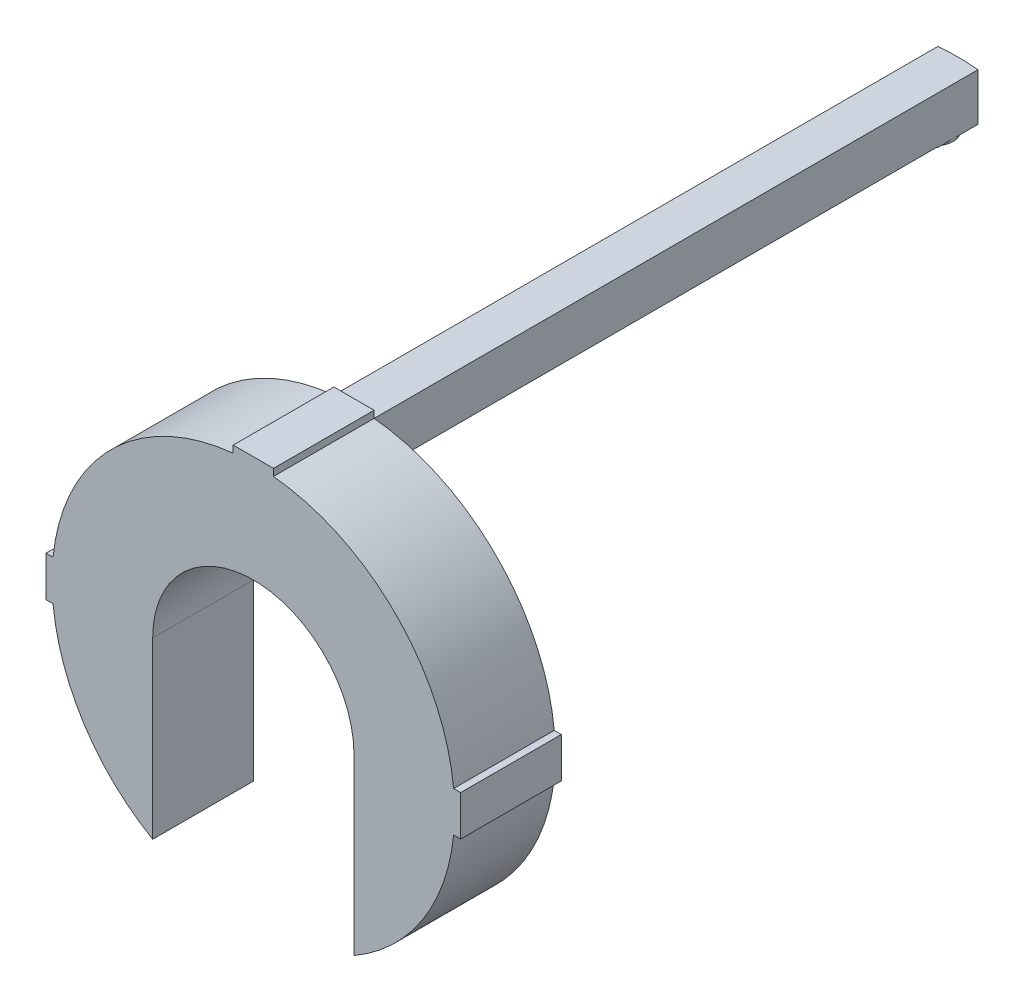
ISO-10303-21;
HEADER;
FILE_DESCRIPTION(('STEP AP214'),'2;1');
FILE_NAME('part.step','',(''),(''),'','','');
FILE_SCHEMA(('AUTOMOTIVE_DESIGN { 1 0 10303 214 1 1 1 1 }'));
ENDSEC;
DATA;
#1=APPLICATION_CONTEXT('core data for automotive mechanical design processes');
#2=APPLICATION_PROTOCOL_DEFINITION('international standard','automotive_design',2000,#1);
#3=PRODUCT_CONTEXT('',#1,'mechanical');
#4=PRODUCT('Part','Part','',(#3));
#5=PRODUCT_RELATED_PRODUCT_CATEGORY('part','',(#4));
#6=PRODUCT_DEFINITION_FORMATION('','',#4);
#7=PRODUCT_DEFINITION_CONTEXT('part definition',#1,'design');
#8=PRODUCT_DEFINITION('design','',#6,#7);
#9=PRODUCT_DEFINITION_SHAPE('','',#8);
#10=(LENGTH_UNIT() NAMED_UNIT(*) SI_UNIT(.MILLI.,.METRE.));
#11=(NAMED_UNIT(*) PLANE_ANGLE_UNIT() SI_UNIT($,.RADIAN.));
#12=(NAMED_UNIT(*) SI_UNIT($,.STERADIAN.) SOLID_ANGLE_UNIT());
#13=UNCERTAINTY_MEASURE_WITH_UNIT(LENGTH_MEASURE(1.E-05),#10,'distance_accuracy_value','');
#14=(GEOMETRIC_REPRESENTATION_CONTEXT(3) GLOBAL_UNCERTAINTY_ASSIGNED_CONTEXT((#13)) GLOBAL_UNIT_ASSIGNED_CONTEXT((#10,
#11,#12)) REPRESENTATION_CONTEXT('',''));
#15=CARTESIAN_POINT('',(0.,0.,0.));
#16=DIRECTION('',(0.,0.,1.));
#17=DIRECTION('',(1.,0.,0.));
#18=AXIS2_PLACEMENT_3D('',#15,#16,#17);
#19=CARTESIAN_POINT('',(0.,0.,1.25));
#20=DIRECTION('',(0.,0.,1.));
#21=DIRECTION('',(1.,0.,0.));
#22=AXIS2_PLACEMENT_3D('',#19,#20,#21);
#23=CYLINDRICAL_SURFACE('',#22,2.5);
#24=DIRECTION('',(0.,0.,1.));
#25=VECTOR('',#24,1.);
#26=CARTESIAN_POINT('',(2.5,0.,-7.5));
#27=LINE('',#26,#25);
#28=CARTESIAN_POINT('',(2.5,0.,0.));
#29=VERTEX_POINT('',#28);
#30=CARTESIAN_POINT('',(2.5,0.,2.5));
#31=VERTEX_POINT('',#30);
#32=EDGE_CURVE('E205',#29,#31,#27,.T.);
#33=ORIENTED_EDGE('',*,*,#32,.T.);
#34=CARTESIAN_POINT('',(0.,0.,2.5));
#35=DIRECTION('',(0.,0.,1.));
#36=DIRECTION('',(1.,0.,0.));
#37=AXIS2_PLACEMENT_3D('',#34,#35,#36);
#38=CIRCLE('',#37,2.5);
#39=CARTESIAN_POINT('',(-2.5,0.,2.5));
#40=VERTEX_POINT('',#39);
#41=EDGE_CURVE('E213',#31,#40,#38,.T.);
#42=ORIENTED_EDGE('',*,*,#41,.T.);
#43=DIRECTION('',(0.,0.,1.));
#44=VECTOR('',#43,1.);
#45=CARTESIAN_POINT('',(-2.5,0.,-7.5));
#46=LINE('',#45,#44);
#47=CARTESIAN_POINT('',(-2.5,0.,0.));
#48=VERTEX_POINT('',#47);
#49=EDGE_CURVE('E194',#48,#40,#46,.T.);
#50=ORIENTED_EDGE('',*,*,#49,.F.);
#51=CARTESIAN_POINT('',(0.,0.,0.));
#52=DIRECTION('',(0.,0.,1.));
#53=DIRECTION('',(1.,0.,0.));
#54=AXIS2_PLACEMENT_3D('',#51,#52,#53);
#55=CIRCLE('',#54,2.5);
#56=EDGE_CURVE('E807',#29,#48,#55,.T.);
#57=ORIENTED_EDGE('',*,*,#56,.F.);
#58=EDGE_LOOP('',(#33,#42,#50,#57));
#59=FACE_BOUND('',#58,.T.);
#60=ADVANCED_FACE('F39',(#59),#23,.F.);
#61=CARTESIAN_POINT('',(0.500000000000018,5.15,0.));
#62=DIRECTION('',(1.,0.,0.));
#63=DIRECTION('',(0.,1.,0.));
#64=AXIS2_PLACEMENT_3D('',#61,#62,#63);
#65=PLANE('',#64);
#66=DIRECTION('',(0.,0.,-1.));
#67=VECTOR('',#66,1.);
#68=CARTESIAN_POINT('',(0.500000000000017,4.9749371855331,2.5));
#69=LINE('',#68,#67);
#70=CARTESIAN_POINT('',(0.500000000000017,4.9749371855331,0.));
#71=VERTEX_POINT('',#70);
#72=CARTESIAN_POINT('',(0.500000000000017,4.9749371855331,2.5));
#73=VERTEX_POINT('',#72);
#74=EDGE_CURVE('E285',#71,#73,#69,.F.);
#75=ORIENTED_EDGE('',*,*,#74,.F.);
#76=DIRECTION('',(0.,1.,0.));
#77=VECTOR('',#76,1.);
#78=CARTESIAN_POINT('',(0.500000000000018,5.15,0.));
#79=LINE('',#78,#77);
#80=CARTESIAN_POINT('',(0.500000000000018,5.15,0.));
#81=VERTEX_POINT('',#80);
#82=EDGE_CURVE('E358',#71,#81,#79,.T.);
#83=ORIENTED_EDGE('',*,*,#82,.T.);
#84=DIRECTION('',(0.,0.,1.));
#85=VECTOR('',#84,1.);
#86=CARTESIAN_POINT('',(0.500000000000018,5.15,0.));
#87=LINE('',#86,#85);
#88=CARTESIAN_POINT('',(0.500000000000018,5.15,2.5));
#89=VERTEX_POINT('',#88);
#90=EDGE_CURVE('E276',#81,#89,#87,.T.);
#91=ORIENTED_EDGE('',*,*,#90,.T.);
#92=DIRECTION('',(0.,1.,0.));
#93=VECTOR('',#92,1.);
#94=CARTESIAN_POINT('',(0.500000000000018,5.15,2.5));
#95=LINE('',#94,#93);
#96=EDGE_CURVE('E271',#73,#89,#95,.T.);
#97=ORIENTED_EDGE('',*,*,#96,.F.);
#98=EDGE_LOOP('',(#75,#83,#91,#97));
#99=FACE_BOUND('',#98,.T.);
#100=ADVANCED_FACE('F382',(#99),#65,.T.);
#101=CARTESIAN_POINT('',(-0.499999999999982,5.15,0.));
#102=DIRECTION('',(-1.,0.,0.));
#103=DIRECTION('',(0.,-1.,0.));
#104=AXIS2_PLACEMENT_3D('',#101,#102,#103);
#105=PLANE('',#104);
#106=DIRECTION('',(0.,0.,1.));
#107=VECTOR('',#106,1.);
#108=CARTESIAN_POINT('',(-0.499999999999982,5.15,0.));
#109=LINE('',#108,#107);
#110=CARTESIAN_POINT('',(-0.499999999999982,5.15,0.));
#111=VERTEX_POINT('',#110);
#112=CARTESIAN_POINT('',(-0.499999999999982,5.15,2.5));
#113=VERTEX_POINT('',#112);
#114=EDGE_CURVE('E275',#111,#113,#109,.T.);
#115=ORIENTED_EDGE('',*,*,#114,.F.);
#116=DIRECTION('',(0.,-1.,0.));
#117=VECTOR('',#116,1.);
#118=CARTESIAN_POINT('',(-0.499999999999982,5.15,0.));
#119=LINE('',#118,#117);
#120=CARTESIAN_POINT('',(-0.499999999999983,4.9749371855331,0.));
#121=VERTEX_POINT('',#120);
#122=EDGE_CURVE('E500',#111,#121,#119,.T.);
#123=ORIENTED_EDGE('',*,*,#122,.T.);
#124=DIRECTION('',(0.,0.,-1.));
#125=VECTOR('',#124,1.);
#126=CARTESIAN_POINT('',(-0.499999999999983,4.9749371855331,2.5));
#127=LINE('',#126,#125);
#128=CARTESIAN_POINT('',(-0.499999999999983,4.9749371855331,2.5));
#129=VERTEX_POINT('',#128);
#130=EDGE_CURVE('E279',#129,#121,#127,.T.);
#131=ORIENTED_EDGE('',*,*,#130,.F.);
#132=DIRECTION('',(0.,-1.,0.));
#133=VECTOR('',#132,1.);
#134=CARTESIAN_POINT('',(-0.499999999999982,5.15,2.5));
#135=LINE('',#134,#133);
#136=EDGE_CURVE('E268',#113,#129,#135,.T.);
#137=ORIENTED_EDGE('',*,*,#136,.F.);
#138=EDGE_LOOP('',(#115,#123,#131,#137));
#139=FACE_BOUND('',#138,.T.);
#140=ADVANCED_FACE('F387',(#139),#105,.T.);
#141=CARTESIAN_POINT('',(0.500000000000018,5.15,0.));
#142=DIRECTION('',(0.,1.,0.));
#143=DIRECTION('',(-1.,0.,0.));
#144=AXIS2_PLACEMENT_3D('',#141,#142,#143);
#145=PLANE('',#144);
#146=ORIENTED_EDGE('',*,*,#90,.F.);
#147=DIRECTION('',(-1.,0.,0.));
#148=VECTOR('',#147,1.);
#149=CARTESIAN_POINT('',(0.500000000000018,5.15,0.));
#150=LINE('',#149,#148);
#151=EDGE_CURVE('E497',#81,#111,#150,.T.);
#152=ORIENTED_EDGE('',*,*,#151,.T.);
#153=ORIENTED_EDGE('',*,*,#114,.T.);
#154=DIRECTION('',(-1.,0.,0.));
#155=VECTOR('',#154,1.);
#156=CARTESIAN_POINT('',(0.500000000000018,5.15,2.5));
#157=LINE('',#156,#155);
#158=EDGE_CURVE('E264',#89,#113,#157,.T.);
#159=ORIENTED_EDGE('',*,*,#158,.F.);
#160=EDGE_LOOP('',(#146,#152,#153,#159));
#161=FACE_BOUND('',#160,.T.);
#162=ADVANCED_FACE('F416',(#161),#145,.T.);
#163=CARTESIAN_POINT('',(0.,0.,-15.));
#164=DIRECTION('',(0.,0.,-1.));
#165=DIRECTION('',(-1.,0.,0.));
#166=AXIS2_PLACEMENT_3D('',#163,#164,#165);
#167=PLANE('',#166);
#168=CARTESIAN_POINT('',(0.,0.,-15.));
#169=DIRECTION('',(0.,0.,-1.));
#170=DIRECTION('',(-1.,0.,0.));
#171=AXIS2_PLACEMENT_3D('',#168,#169,#170);
#172=CIRCLE('',#171,5.);
#173=CARTESIAN_POINT('',(0.500000000000017,4.9749371855331,-15.));
#174=VERTEX_POINT('',#173);
#175=CARTESIAN_POINT('',(-0.499999999999982,4.9749371855331,-15.));
#176=VERTEX_POINT('',#175);
#177=EDGE_CURVE('E11',#174,#176,#172,.F.);
#178=ORIENTED_EDGE('',*,*,#177,.F.);
#179=DIRECTION('',(0.,-1.,0.));
#180=VECTOR('',#179,1.);
#181=CARTESIAN_POINT('',(0.500000000000017,5.15,-15.));
#182=LINE('',#181,#180);
#183=CARTESIAN_POINT('',(0.500000000000017,3.8,-15.));
#184=VERTEX_POINT('',#183);
#185=EDGE_CURVE('E513',#174,#184,#182,.T.);
#186=ORIENTED_EDGE('',*,*,#185,.T.);
#187=DIRECTION('',(-1.,0.,0.));
#188=VECTOR('',#187,1.);
#189=CARTESIAN_POINT('',(0.500000000000017,3.8,-15.));
#190=LINE('',#189,#188);
#191=CARTESIAN_POINT('',(-0.499999999999982,3.8,-15.));
#192=VERTEX_POINT('',#191);
#193=EDGE_CURVE('E518',#184,#192,#190,.T.);
#194=ORIENTED_EDGE('',*,*,#193,.T.);
#195=DIRECTION('',(0.,1.,0.));
#196=VECTOR('',#195,1.);
#197=CARTESIAN_POINT('',(-0.499999999999982,5.15,-15.));
#198=LINE('',#197,#196);
#199=EDGE_CURVE('E527',#192,#176,#198,.T.);
#200=ORIENTED_EDGE('',*,*,#199,.T.);
#201=EDGE_LOOP('',(#178,#186,#194,#200));
#202=FACE_BOUND('',#201,.T.);
#203=ADVANCED_FACE('F419',(#202),#167,.T.);
#204=CARTESIAN_POINT('',(0.,0.,-14.));
#205=DIRECTION('',(0.,0.,-1.));
#206=DIRECTION('',(-1.,0.,0.));
#207=AXIS2_PLACEMENT_3D('',#204,#205,#206);
#208=PLANE('',#207);
#209=DIRECTION('',(-1.,0.,0.));
#210=VECTOR('',#209,1.);
#211=CARTESIAN_POINT('',(0.500000000000017,3.8,-14.));
#212=LINE('',#211,#210);
#213=CARTESIAN_POINT('',(-0.265329983228428,3.8,-14.));
#214=VERTEX_POINT('',#213);
#215=CARTESIAN_POINT('',(-0.499999999999982,3.8,-14.));
#216=VERTEX_POINT('',#215);
#217=EDGE_CURVE('E340',#214,#216,#212,.T.);
#218=ORIENTED_EDGE('',*,*,#217,.F.);
#219=DIRECTION('',(0.,1.,0.));
#220=VECTOR('',#219,1.);
#221=CARTESIAN_POINT('',(-0.265329983228448,-1.85,-14.));
#222=LINE('',#221,#220);
#223=CARTESIAN_POINT('',(-0.265329983228582,3.840846260917,-13.9999999999998));
#224=VERTEX_POINT('',#223);
#225=EDGE_CURVE('E48',#214,#224,#222,.T.);
#226=ORIENTED_EDGE('',*,*,#225,.T.);
#227=CARTESIAN_POINT('',(0.,0.,-14.));
#228=DIRECTION('',(0.,0.,-1.));
#229=DIRECTION('',(-1.,0.,0.));
#230=AXIS2_PLACEMENT_3D('',#227,#228,#229);
#231=CIRCLE('',#230,3.85);
#232=CARTESIAN_POINT('',(-0.499999999999987,3.81739439932528,-14.));
#233=VERTEX_POINT('',#232);
#234=EDGE_CURVE('E541',#233,#224,#231,.T.);
#235=ORIENTED_EDGE('',*,*,#234,.F.);
#236=DIRECTION('',(0.,-1.,0.));
#237=VECTOR('',#236,1.);
#238=CARTESIAN_POINT('',(-0.499999999999982,5.15,-14.));
#239=LINE('',#238,#237);
#240=EDGE_CURVE('E537',#233,#216,#239,.T.);
#241=ORIENTED_EDGE('',*,*,#240,.T.);
#242=EDGE_LOOP('',(#218,#226,#235,#241));
#243=FACE_BOUND('',#242,.T.);
#244=ADVANCED_FACE('F410',(#243),#208,.F.);
#245=DIRECTION('',(0.,0.,1.));
#246=VECTOR('',#245,1.);
#247=CARTESIAN_POINT('',(0.500000000000017,4.9749371855331,-17.));
#248=LINE('',#247,#246);
#249=EDGE_CURVE('E54',#71,#174,#248,.F.);
#250=ORIENTED_EDGE('',*,*,#249,.F.);
#251=DIRECTION('',(0.,-1.,0.));
#252=VECTOR('',#251,1.);
#253=CARTESIAN_POINT('',(0.500000000000017,5.15,0.));
#254=LINE('',#253,#252);
#255=CARTESIAN_POINT('',(0.500000000000013,3.81739439932528,0.));
#256=VERTEX_POINT('',#255);
#257=EDGE_CURVE('E327',#71,#256,#254,.T.);
#258=ORIENTED_EDGE('',*,*,#257,.T.);
#259=DIRECTION('',(0.,0.,1.));
#260=VECTOR('',#259,1.);
#261=CARTESIAN_POINT('',(0.500000000000013,3.81739439932528,-14.));
#262=LINE('',#261,#260);
#263=CARTESIAN_POINT('',(0.500000000000013,3.81739439932528,-14.));
#264=VERTEX_POINT('',#263);
#265=EDGE_CURVE('E514',#256,#264,#262,.F.);
#266=ORIENTED_EDGE('',*,*,#265,.T.);
#267=DIRECTION('',(0.,1.,0.));
#268=VECTOR('',#267,1.);
#269=CARTESIAN_POINT('',(0.500000000000018,5.15,-14.));
#270=LINE('',#269,#268);
#271=CARTESIAN_POINT('',(0.500000000000017,3.8,-14.));
#272=VERTEX_POINT('',#271);
#273=EDGE_CURVE('E521',#272,#264,#270,.T.);
#274=ORIENTED_EDGE('',*,*,#273,.F.);
#275=DIRECTION('',(0.,0.,1.));
#276=VECTOR('',#275,1.);
#277=CARTESIAN_POINT('',(0.500000000000017,3.8,-15.));
#278=LINE('',#277,#276);
#279=EDGE_CURVE('E222',#184,#272,#278,.T.);
#280=ORIENTED_EDGE('',*,*,#279,.F.);
#281=ORIENTED_EDGE('',*,*,#185,.F.);
#282=EDGE_LOOP('',(#250,#258,#266,#274,#280,#281));
#283=FACE_BOUND('',#282,.T.);
#284=ADVANCED_FACE('F390',(#283),#65,.T.);
#285=DIRECTION('',(0.,0.,1.));
#286=VECTOR('',#285,1.);
#287=CARTESIAN_POINT('',(-0.499999999999983,4.9749371855331,-17.));
#288=LINE('',#287,#286);
#289=EDGE_CURVE('E508',#176,#121,#288,.T.);
#290=ORIENTED_EDGE('',*,*,#289,.F.);
#291=ORIENTED_EDGE('',*,*,#199,.F.);
#292=DIRECTION('',(0.,0.,1.));
#293=VECTOR('',#292,1.);
#294=CARTESIAN_POINT('',(-0.499999999999982,3.8,-15.));
#295=LINE('',#294,#293);
#296=EDGE_CURVE('E230',#192,#216,#295,.T.);
#297=ORIENTED_EDGE('',*,*,#296,.T.);
#298=ORIENTED_EDGE('',*,*,#240,.F.);
#299=DIRECTION('',(0.,0.,1.));
#300=VECTOR('',#299,1.);
#301=CARTESIAN_POINT('',(-0.499999999999987,3.81739439932528,-14.));
#302=LINE('',#301,#300);
#303=CARTESIAN_POINT('',(-0.499999999999987,3.81739439932528,0.));
#304=VERTEX_POINT('',#303);
#305=EDGE_CURVE('E339',#233,#304,#302,.T.);
#306=ORIENTED_EDGE('',*,*,#305,.T.);
#307=DIRECTION('',(0.,1.,0.));
#308=VECTOR('',#307,1.);
#309=CARTESIAN_POINT('',(-0.499999999999982,5.15,0.));
#310=LINE('',#309,#308);
#311=EDGE_CURVE('E506',#304,#121,#310,.T.);
#312=ORIENTED_EDGE('',*,*,#311,.T.);
#313=EDGE_LOOP('',(#290,#291,#297,#298,#306,#312));
#314=FACE_BOUND('',#313,.T.);
#315=ADVANCED_FACE('F409',(#314),#105,.T.);
#316=CARTESIAN_POINT('',(0.,0.,0.));
#317=DIRECTION('',(0.,0.,1.));
#318=DIRECTION('',(1.,0.,0.));
#319=AXIS2_PLACEMENT_3D('',#316,#317,#318);
#320=PLANE('',#319);
#321=CARTESIAN_POINT('',(0.,0.,0.));
#322=DIRECTION('',(0.,0.,1.));
#323=DIRECTION('',(1.,0.,0.));
#324=AXIS2_PLACEMENT_3D('',#321,#322,#323);
#325=CIRCLE('',#324,5.);
#326=CARTESIAN_POINT('',(2.5,-4.33012701892219,0.));
#327=VERTEX_POINT('',#326);
#328=CARTESIAN_POINT('',(4.9749371855331,-0.5,0.));
#329=VERTEX_POINT('',#328);
#330=EDGE_CURVE('E334',#327,#329,#325,.T.);
#331=ORIENTED_EDGE('',*,*,#330,.F.);
#332=DIRECTION('',(0.,1.,0.));
#333=VECTOR('',#332,1.);
#334=CARTESIAN_POINT('',(2.5,0.,0.));
#335=LINE('',#334,#333);
#336=EDGE_CURVE('E444',#327,#29,#335,.T.);
#337=ORIENTED_EDGE('',*,*,#336,.T.);
#338=ORIENTED_EDGE('',*,*,#56,.T.);
#339=DIRECTION('',(0.,-1.,0.));
#340=VECTOR('',#339,1.);
#341=CARTESIAN_POINT('',(-2.5,0.,0.));
#342=LINE('',#341,#340);
#343=CARTESIAN_POINT('',(-2.5,-4.33012701892219,0.));
#344=VERTEX_POINT('',#343);
#345=EDGE_CURVE('E200',#48,#344,#342,.T.);
#346=ORIENTED_EDGE('',*,*,#345,.T.);
#347=CARTESIAN_POINT('',(-4.9749371855331,-0.5,0.));
#348=VERTEX_POINT('',#347);
#349=EDGE_CURVE('E330',#348,#344,#325,.T.);
#350=ORIENTED_EDGE('',*,*,#349,.F.);
#351=DIRECTION('',(1.,0.,0.));
#352=VECTOR('',#351,1.);
#353=CARTESIAN_POINT('',(-5.15,-0.5,0.));
#354=LINE('',#353,#352);
#355=CARTESIAN_POINT('',(-5.15,-0.5,0.));
#356=VERTEX_POINT('',#355);
#357=EDGE_CURVE('E294',#356,#348,#354,.T.);
#358=ORIENTED_EDGE('',*,*,#357,.F.);
#359=DIRECTION('',(0.,-1.,0.));
#360=VECTOR('',#359,1.);
#361=CARTESIAN_POINT('',(-5.15,0.5,0.));
#362=LINE('',#361,#360);
#363=CARTESIAN_POINT('',(-5.15,0.5,0.));
#364=VERTEX_POINT('',#363);
#365=EDGE_CURVE('E290',#364,#356,#362,.T.);
#366=ORIENTED_EDGE('',*,*,#365,.F.);
#367=DIRECTION('',(-1.,0.,0.));
#368=VECTOR('',#367,1.);
#369=CARTESIAN_POINT('',(-5.15,0.5,0.));
#370=LINE('',#369,#368);
#371=CARTESIAN_POINT('',(-4.9749371855331,0.5,0.));
#372=VERTEX_POINT('',#371);
#373=EDGE_CURVE('E298',#372,#364,#370,.T.);
#374=ORIENTED_EDGE('',*,*,#373,.F.);
#375=EDGE_CURVE('E324',#121,#372,#325,.T.);
#376=ORIENTED_EDGE('',*,*,#375,.F.);
#377=ORIENTED_EDGE('',*,*,#311,.F.);
#378=CARTESIAN_POINT('',(0.,0.,0.));
#379=DIRECTION('',(0.,0.,-1.));
#380=DIRECTION('',(-1.,0.,0.));
#381=AXIS2_PLACEMENT_3D('',#378,#379,#380);
#382=CIRCLE('',#381,3.85);
#383=EDGE_CURVE('E542',#304,#256,#382,.T.);
#384=ORIENTED_EDGE('',*,*,#383,.T.);
#385=ORIENTED_EDGE('',*,*,#257,.F.);
#386=CARTESIAN_POINT('',(4.9749371855331,0.5,0.));
#387=VERTEX_POINT('',#386);
#388=EDGE_CURVE('E450',#387,#71,#325,.T.);
#389=ORIENTED_EDGE('',*,*,#388,.F.);
#390=DIRECTION('',(-1.,0.,0.));
#391=VECTOR('',#390,1.);
#392=CARTESIAN_POINT('',(5.15,0.5,0.));
#393=LINE('',#392,#391);
#394=CARTESIAN_POINT('',(5.15,0.5,0.));
#395=VERTEX_POINT('',#394);
#396=EDGE_CURVE('E238',#395,#387,#393,.T.);
#397=ORIENTED_EDGE('',*,*,#396,.F.);
#398=DIRECTION('',(0.,1.,0.));
#399=VECTOR('',#398,1.);
#400=CARTESIAN_POINT('',(5.15,-0.5,0.));
#401=LINE('',#400,#399);
#402=CARTESIAN_POINT('',(5.15,-0.5,0.));
#403=VERTEX_POINT('',#402);
#404=EDGE_CURVE('E234',#403,#395,#401,.T.);
#405=ORIENTED_EDGE('',*,*,#404,.F.);
#406=DIRECTION('',(1.,0.,0.));
#407=VECTOR('',#406,1.);
#408=CARTESIAN_POINT('',(5.15,-0.5,0.));
#409=LINE('',#408,#407);
#410=EDGE_CURVE('E242',#329,#403,#409,.T.);
#411=ORIENTED_EDGE('',*,*,#410,.F.);
#412=EDGE_LOOP('',(#331,#337,#338,#346,#350,#358,#366,#374,#376,#377,#384,#385,#389,#397,#405,#411));
#413=FACE_BOUND('',#412,.T.);
#414=ADVANCED_FACE('F414',(#413),#320,.F.);
#415=CARTESIAN_POINT('',(0.,0.,2.5));
#416=DIRECTION('',(0.,0.,-1.));
#417=DIRECTION('',(-1.,0.,0.));
#418=AXIS2_PLACEMENT_3D('',#415,#416,#417);
#419=CYLINDRICAL_SURFACE('',#418,5.);
#420=ORIENTED_EDGE('',*,*,#349,.T.);
#421=DIRECTION('',(0.,0.,-1.));
#422=VECTOR('',#421,1.);
#423=CARTESIAN_POINT('',(-2.5,-4.33012701892219,2.5));
#424=LINE('',#423,#422);
#425=CARTESIAN_POINT('',(-2.5,-4.33012701892219,2.5));
#426=VERTEX_POINT('',#425);
#427=EDGE_CURVE('E817',#344,#426,#424,.F.);
#428=ORIENTED_EDGE('',*,*,#427,.T.);
#429=CARTESIAN_POINT('',(0.,0.,2.5));
#430=DIRECTION('',(0.,0.,1.));
#431=DIRECTION('',(1.,0.,0.));
#432=AXIS2_PLACEMENT_3D('',#429,#430,#431);
#433=CIRCLE('',#432,5.);
#434=CARTESIAN_POINT('',(-4.9749371855331,-0.5,2.5));
#435=VERTEX_POINT('',#434);
#436=EDGE_CURVE('E215',#435,#426,#433,.T.);
#437=ORIENTED_EDGE('',*,*,#436,.F.);
#438=DIRECTION('',(0.,0.,-1.));
#439=VECTOR('',#438,1.);
#440=CARTESIAN_POINT('',(-4.9749371855331,-0.5,2.5));
#441=LINE('',#440,#439);
#442=EDGE_CURVE('E314',#435,#348,#441,.T.);
#443=ORIENTED_EDGE('',*,*,#442,.T.);
#444=EDGE_LOOP('',(#420,#428,#437,#443));
#445=FACE_BOUND('',#444,.T.);
#446=ADVANCED_FACE('F434',(#445),#419,.T.);
#447=CARTESIAN_POINT('',(2.5,-4.33012701892219,2.5));
#448=VERTEX_POINT('',#447);
#449=CARTESIAN_POINT('',(4.9749371855331,-0.5,2.5));
#450=VERTEX_POINT('',#449);
#451=EDGE_CURVE('E328',#448,#450,#433,.T.);
#452=ORIENTED_EDGE('',*,*,#451,.F.);
#453=DIRECTION('',(0.,0.,-1.));
#454=VECTOR('',#453,1.);
#455=CARTESIAN_POINT('',(2.5,-4.33012701892219,2.5));
#456=LINE('',#455,#454);
#457=EDGE_CURVE('E812',#448,#327,#456,.T.);
#458=ORIENTED_EDGE('',*,*,#457,.T.);
#459=ORIENTED_EDGE('',*,*,#330,.T.);
#460=DIRECTION('',(0.,0.,-1.));
#461=VECTOR('',#460,1.);
#462=CARTESIAN_POINT('',(4.9749371855331,-0.5,2.5));
#463=LINE('',#462,#461);
#464=EDGE_CURVE('E260',#329,#450,#463,.F.);
#465=ORIENTED_EDGE('',*,*,#464,.T.);
#466=EDGE_LOOP('',(#452,#458,#459,#465));
#467=FACE_BOUND('',#466,.T.);
#468=ADVANCED_FACE('F439',(#467),#419,.T.);
#469=CARTESIAN_POINT('',(4.9749371855331,0.5,2.5));
#470=VERTEX_POINT('',#469);
#471=EDGE_CURVE('E474',#470,#73,#433,.T.);
#472=ORIENTED_EDGE('',*,*,#471,.F.);
#473=DIRECTION('',(0.,0.,-1.));
#474=VECTOR('',#473,1.);
#475=CARTESIAN_POINT('',(4.9749371855331,0.5,2.5));
#476=LINE('',#475,#474);
#477=EDGE_CURVE('E254',#470,#387,#476,.T.);
#478=ORIENTED_EDGE('',*,*,#477,.T.);
#479=ORIENTED_EDGE('',*,*,#388,.T.);
#480=ORIENTED_EDGE('',*,*,#74,.T.);
#481=EDGE_LOOP('',(#472,#478,#479,#480));
#482=FACE_BOUND('',#481,.T.);
#483=ADVANCED_FACE('F484',(#482),#419,.T.);
#484=CARTESIAN_POINT('',(-4.9749371855331,0.5,2.5));
#485=VERTEX_POINT('',#484);
#486=EDGE_CURVE('E329',#129,#485,#433,.T.);
#487=ORIENTED_EDGE('',*,*,#486,.F.);
#488=ORIENTED_EDGE('',*,*,#130,.T.);
#489=ORIENTED_EDGE('',*,*,#375,.T.);
#490=DIRECTION('',(0.,0.,-1.));
#491=VECTOR('',#490,1.);
#492=CARTESIAN_POINT('',(-4.9749371855331,0.5,2.5));
#493=LINE('',#492,#491);
#494=EDGE_CURVE('E320',#372,#485,#493,.F.);
#495=ORIENTED_EDGE('',*,*,#494,.T.);
#496=EDGE_LOOP('',(#487,#488,#489,#495));
#497=FACE_BOUND('',#496,.T.);
#498=ADVANCED_FACE('F41',(#497),#419,.T.);
#499=CARTESIAN_POINT('',(0.,0.,2.5));
#500=DIRECTION('',(0.,0.,1.));
#501=DIRECTION('',(1.,0.,0.));
#502=AXIS2_PLACEMENT_3D('',#499,#500,#501);
#503=PLANE('',#502);
#504=DIRECTION('',(0.,1.,0.));
#505=VECTOR('',#504,1.);
#506=CARTESIAN_POINT('',(2.5,0.,2.5));
#507=LINE('',#506,#505);
#508=EDGE_CURVE('E206',#448,#31,#507,.T.);
#509=ORIENTED_EDGE('',*,*,#508,.F.);
#510=ORIENTED_EDGE('',*,*,#451,.T.);
#511=DIRECTION('',(1.,0.,0.));
#512=VECTOR('',#511,1.);
#513=CARTESIAN_POINT('',(5.15,-0.5,2.5));
#514=LINE('',#513,#512);
#515=CARTESIAN_POINT('',(5.15,-0.5,2.5));
#516=VERTEX_POINT('',#515);
#517=EDGE_CURVE('E239',#450,#516,#514,.T.);
#518=ORIENTED_EDGE('',*,*,#517,.T.);
#519=DIRECTION('',(0.,1.,0.));
#520=VECTOR('',#519,1.);
#521=CARTESIAN_POINT('',(5.15,-0.5,2.5));
#522=LINE('',#521,#520);
#523=CARTESIAN_POINT('',(5.15,0.5,2.5));
#524=VERTEX_POINT('',#523);
#525=EDGE_CURVE('E221',#516,#524,#522,.T.);
#526=ORIENTED_EDGE('',*,*,#525,.T.);
#527=DIRECTION('',(-1.,0.,0.));
#528=VECTOR('',#527,1.);
#529=CARTESIAN_POINT('',(5.15,0.5,2.5));
#530=LINE('',#529,#528);
#531=EDGE_CURVE('E227',#524,#470,#530,.T.);
#532=ORIENTED_EDGE('',*,*,#531,.T.);
#533=ORIENTED_EDGE('',*,*,#471,.T.);
#534=ORIENTED_EDGE('',*,*,#96,.T.);
#535=ORIENTED_EDGE('',*,*,#158,.T.);
#536=ORIENTED_EDGE('',*,*,#136,.T.);
#537=ORIENTED_EDGE('',*,*,#486,.T.);
#538=DIRECTION('',(-1.,0.,0.));
#539=VECTOR('',#538,1.);
#540=CARTESIAN_POINT('',(-5.15,0.5,2.5));
#541=LINE('',#540,#539);
#542=CARTESIAN_POINT('',(-5.15,0.5,2.5));
#543=VERTEX_POINT('',#542);
#544=EDGE_CURVE('E295',#485,#543,#541,.T.);
#545=ORIENTED_EDGE('',*,*,#544,.T.);
#546=DIRECTION('',(0.,-1.,0.));
#547=VECTOR('',#546,1.);
#548=CARTESIAN_POINT('',(-5.15,0.5,2.5));
#549=LINE('',#548,#547);
#550=CARTESIAN_POINT('',(-5.15,-0.5,2.5));
#551=VERTEX_POINT('',#550);
#552=EDGE_CURVE('E289',#543,#551,#549,.T.);
#553=ORIENTED_EDGE('',*,*,#552,.T.);
#554=DIRECTION('',(1.,0.,0.));
#555=VECTOR('',#554,1.);
#556=CARTESIAN_POINT('',(-5.15,-0.5,2.5));
#557=LINE('',#556,#555);
#558=EDGE_CURVE('E305',#551,#435,#557,.T.);
#559=ORIENTED_EDGE('',*,*,#558,.T.);
#560=ORIENTED_EDGE('',*,*,#436,.T.);
#561=DIRECTION('',(0.,-1.,0.));
#562=VECTOR('',#561,1.);
#563=CARTESIAN_POINT('',(-2.5,0.,2.5));
#564=LINE('',#563,#562);
#565=EDGE_CURVE('E197',#40,#426,#564,.T.);
#566=ORIENTED_EDGE('',*,*,#565,.F.);
#567=ORIENTED_EDGE('',*,*,#41,.F.);
#568=EDGE_LOOP('',(#509,#510,#518,#526,#532,#533,#534,#535,#536,#537,#545,#553,#559,#560,#566,#567));
#569=FACE_BOUND('',#568,.T.);
#570=ADVANCED_FACE('F212',(#569),#503,.T.);
#571=CARTESIAN_POINT('',(-5.15,0.5,0.));
#572=DIRECTION('',(0.,1.,0.));
#573=DIRECTION('',(0.,0.,1.));
#574=AXIS2_PLACEMENT_3D('',#571,#572,#573);
#575=PLANE('',#574);
#576=ORIENTED_EDGE('',*,*,#494,.F.);
#577=ORIENTED_EDGE('',*,*,#373,.T.);
#578=DIRECTION('',(0.,0.,1.));
#579=VECTOR('',#578,1.);
#580=CARTESIAN_POINT('',(-5.15,0.5,0.));
#581=LINE('',#580,#579);
#582=EDGE_CURVE('E310',#364,#543,#581,.T.);
#583=ORIENTED_EDGE('',*,*,#582,.T.);
#584=ORIENTED_EDGE('',*,*,#544,.F.);
#585=EDGE_LOOP('',(#576,#577,#583,#584));
#586=FACE_BOUND('',#585,.T.);
#587=ADVANCED_FACE('F421',(#586),#575,.T.);
#588=CARTESIAN_POINT('',(-5.15,-0.5,0.));
#589=DIRECTION('',(0.,-1.,0.));
#590=DIRECTION('',(0.,0.,-1.));
#591=AXIS2_PLACEMENT_3D('',#588,#589,#590);
#592=PLANE('',#591);
#593=ORIENTED_EDGE('',*,*,#442,.F.);
#594=ORIENTED_EDGE('',*,*,#558,.F.);
#595=DIRECTION('',(0.,0.,1.));
#596=VECTOR('',#595,1.);
#597=CARTESIAN_POINT('',(-5.15,-0.5,0.));
#598=LINE('',#597,#596);
#599=EDGE_CURVE('E301',#356,#551,#598,.T.);
#600=ORIENTED_EDGE('',*,*,#599,.F.);
#601=ORIENTED_EDGE('',*,*,#357,.T.);
#602=EDGE_LOOP('',(#593,#594,#600,#601));
#603=FACE_BOUND('',#602,.T.);
#604=ADVANCED_FACE('F424',(#603),#592,.T.);
#605=CARTESIAN_POINT('',(-5.15,0.5,0.));
#606=DIRECTION('',(-1.,0.,0.));
#607=DIRECTION('',(0.,0.,1.));
#608=AXIS2_PLACEMENT_3D('',#605,#606,#607);
#609=PLANE('',#608);
#610=ORIENTED_EDGE('',*,*,#552,.F.);
#611=ORIENTED_EDGE('',*,*,#582,.F.);
#612=ORIENTED_EDGE('',*,*,#365,.T.);
#613=ORIENTED_EDGE('',*,*,#599,.T.);
#614=EDGE_LOOP('',(#610,#611,#612,#613));
#615=FACE_BOUND('',#614,.T.);
#616=ADVANCED_FACE('F399',(#615),#609,.T.);
#617=CARTESIAN_POINT('',(5.15,-0.5,0.));
#618=DIRECTION('',(0.,-1.,0.));
#619=DIRECTION('',(0.,0.,-1.));
#620=AXIS2_PLACEMENT_3D('',#617,#618,#619);
#621=PLANE('',#620);
#622=ORIENTED_EDGE('',*,*,#464,.F.);
#623=ORIENTED_EDGE('',*,*,#410,.T.);
#624=DIRECTION('',(0.,0.,1.));
#625=VECTOR('',#624,1.);
#626=CARTESIAN_POINT('',(5.15,-0.5,0.));
#627=LINE('',#626,#625);
#628=EDGE_CURVE('E250',#403,#516,#627,.T.);
#629=ORIENTED_EDGE('',*,*,#628,.T.);
#630=ORIENTED_EDGE('',*,*,#517,.F.);
#631=EDGE_LOOP('',(#622,#623,#629,#630));
#632=FACE_BOUND('',#631,.T.);
#633=ADVANCED_FACE('F395',(#632),#621,.T.);
#634=CARTESIAN_POINT('',(5.15,0.5,0.));
#635=DIRECTION('',(0.,1.,0.));
#636=DIRECTION('',(0.,0.,1.));
#637=AXIS2_PLACEMENT_3D('',#634,#635,#636);
#638=PLANE('',#637);
#639=ORIENTED_EDGE('',*,*,#477,.F.);
#640=ORIENTED_EDGE('',*,*,#531,.F.);
#641=DIRECTION('',(0.,0.,1.));
#642=VECTOR('',#641,1.);
#643=CARTESIAN_POINT('',(5.15,0.5,0.));
#644=LINE('',#643,#642);
#645=EDGE_CURVE('E244',#395,#524,#644,.T.);
#646=ORIENTED_EDGE('',*,*,#645,.F.);
#647=ORIENTED_EDGE('',*,*,#396,.T.);
#648=EDGE_LOOP('',(#639,#640,#646,#647));
#649=FACE_BOUND('',#648,.T.);
#650=ADVANCED_FACE('F398',(#649),#638,.T.);
#651=CARTESIAN_POINT('',(5.15,-0.5,0.));
#652=DIRECTION('',(1.,0.,0.));
#653=DIRECTION('',(0.,0.,-1.));
#654=AXIS2_PLACEMENT_3D('',#651,#652,#653);
#655=PLANE('',#654);
#656=ORIENTED_EDGE('',*,*,#525,.F.);
#657=ORIENTED_EDGE('',*,*,#628,.F.);
#658=ORIENTED_EDGE('',*,*,#404,.T.);
#659=ORIENTED_EDGE('',*,*,#645,.T.);
#660=EDGE_LOOP('',(#656,#657,#658,#659));
#661=FACE_BOUND('',#660,.T.);
#662=ADVANCED_FACE('F403',(#661),#655,.T.);
#663=CARTESIAN_POINT('',(0.500000000000017,3.8,-15.));
#664=DIRECTION('',(0.,1.,0.));
#665=DIRECTION('',(0.,0.,1.));
#666=AXIS2_PLACEMENT_3D('',#663,#664,#665);
#667=PLANE('',#666);
#668=CARTESIAN_POINT('',(0.265329983228454,3.8,-14.));
#669=VERTEX_POINT('',#668);
#670=EDGE_CURVE('E335',#272,#669,#212,.T.);
#671=ORIENTED_EDGE('',*,*,#670,.T.);
#672=CARTESIAN_POINT('',(0.,3.8,-14.4));
#673=DIRECTION('',(0.,1.,0.));
#674=DIRECTION('',(0.,0.,1.));
#675=AXIS2_PLACEMENT_3D('',#672,#673,#674);
#676=CIRCLE('',#675,0.48);
#677=EDGE_CURVE('E62',#669,#214,#676,.T.);
#678=ORIENTED_EDGE('',*,*,#677,.T.);
#679=ORIENTED_EDGE('',*,*,#217,.T.);
#680=ORIENTED_EDGE('',*,*,#296,.F.);
#681=ORIENTED_EDGE('',*,*,#193,.F.);
#682=ORIENTED_EDGE('',*,*,#279,.T.);
#683=EDGE_LOOP('',(#671,#678,#679,#680,#681,#682));
#684=FACE_BOUND('',#683,.T.);
#685=ADVANCED_FACE('F393',(#684),#667,.F.);
#686=CARTESIAN_POINT('',(0.,0.,-14.));
#687=DIRECTION('',(0.,0.,1.));
#688=DIRECTION('',(1.,0.,0.));
#689=AXIS2_PLACEMENT_3D('',#686,#687,#688);
#690=CYLINDRICAL_SURFACE('',#689,3.85);
#691=CARTESIAN_POINT('',(-0.479999999999987,3.81996073278247,-14.4));
#692=CARTESIAN_POINT('',(-0.479998858160762,3.81996111758854,-14.4268491552753));
#693=CARTESIAN_POINT('',(-0.477739657678175,3.8202468590463,-14.4537151052496));
#694=CARTESIAN_POINT('',(-0.468762957826202,3.82135852230729,-14.5066993615589));
#695=CARTESIAN_POINT('',(-0.462040796042234,3.82218500900896,-14.5328168561925));
#696=CARTESIAN_POINT('',(-0.444339391984112,3.82428312702616,-14.5835294025543));
#697=CARTESIAN_POINT('',(-0.43336303457757,3.82555445662686,-14.6081254729164));
#698=CARTESIAN_POINT('',(-0.407470981728544,3.82839864993131,-14.655121930735));
#699=CARTESIAN_POINT('',(-0.392555961289177,3.82997146195474,-14.6775226935195));
#700=CARTESIAN_POINT('',(-0.359120998826204,3.83325121172846,-14.7196219832142));
#701=CARTESIAN_POINT('',(-0.340583499278501,3.83495877755863,-14.7393065186727));
#702=CARTESIAN_POINT('',(-0.300467578849943,3.83830998586283,-14.775293729882));
#703=CARTESIAN_POINT('',(-0.278889006950929,3.83995362515712,-14.7915962375835));
#704=CARTESIAN_POINT('',(-0.23321558014302,3.84299820940582,-14.8204067792637));
#705=CARTESIAN_POINT('',(-0.209112681844598,3.84439833827716,-14.8329021556145));
#706=CARTESIAN_POINT('',(-0.159130200650481,3.84679124329568,-14.853662664067));
#707=CARTESIAN_POINT('',(-0.133250683408148,3.84778403448622,-14.8619279523925));
#708=CARTESIAN_POINT('',(-0.0805926506891994,3.84924598045731,-14.8739518734326));
#709=CARTESIAN_POINT('',(-0.0538195218699249,3.84971783661096,-14.8777337629834));
#710=CARTESIAN_POINT('',(-1.47372688168965E-05,3.85009397099584,-14.8807556070918));
#711=CARTESIAN_POINT('',(0.02701690835114,3.84999827144595,-14.8799957394517));
#712=CARTESIAN_POINT('',(0.0804131699950504,3.84925226331573,-14.8739742810523));
#713=CARTESIAN_POINT('',(0.106780655733754,3.84860503628234,-14.8687377024748));
#714=CARTESIAN_POINT('',(0.158259639197569,3.84683216001555,-14.8539505666954));
#715=CARTESIAN_POINT('',(0.183371113140162,3.84570650172691,-14.8443999278412));
#716=CARTESIAN_POINT('',(0.231702702939494,3.84309793946697,-14.8212291685287));
#717=CARTESIAN_POINT('',(0.25491757458615,3.84161408702729,-14.8075982203541));
#718=CARTESIAN_POINT('',(0.298739768024009,3.83845515402281,-14.776661651742));
#719=CARTESIAN_POINT('',(0.319346970776486,3.83678006473478,-14.7593558636466));
#720=CARTESIAN_POINT('',(0.357515801434921,3.83341268483254,-14.7214207666104));
#721=CARTESIAN_POINT('',(0.375055768910956,3.8317203547015,-14.7007696601354));
#722=CARTESIAN_POINT('',(0.406423898218805,3.82852047248421,-14.6568050253219));
#723=CARTESIAN_POINT('',(0.420252048524302,3.82701292097176,-14.6334914887162));
#724=CARTESIAN_POINT('',(0.44380523406552,3.82435329775226,-14.5848445155836));
#725=CARTESIAN_POINT('',(0.453528539595966,3.82320137595578,-14.5595102328874));
#726=CARTESIAN_POINT('',(0.468576845966773,3.82138636042096,-14.5075509172711));
#727=CARTESIAN_POINT('',(0.473902057637028,3.82072324325112,-14.4809259462872));
#728=CARTESIAN_POINT('',(0.479974338436329,3.81996519557743,-14.4273323267127));
#729=CARTESIAN_POINT('',(0.480751887981112,3.81986648229279,-14.4003671830954));
#730=CARTESIAN_POINT('',(0.477787190717607,3.82023841463857,-14.3466910129258));
#731=CARTESIAN_POINT('',(0.474045039734046,3.82070904819795,-14.3199799809982));
#732=CARTESIAN_POINT('',(0.462172828672399,3.82216319371873,-14.2676615705909));
#733=CARTESIAN_POINT('',(0.454057522927323,3.8231449807542,-14.2420507919462));
#734=CARTESIAN_POINT('',(0.433684552416489,3.82550941126384,-14.192553521614));
#735=CARTESIAN_POINT('',(0.421426742826874,3.82689206875239,-14.1686670902458));
#736=CARTESIAN_POINT('',(0.393041756605907,3.82991151113541,-14.1231586451435));
#737=CARTESIAN_POINT('',(0.376894588674472,3.83154959304874,-14.1015491880441));
#738=CARTESIAN_POINT('',(0.341217510418702,3.83489123784089,-14.0613362122644));
#739=CARTESIAN_POINT('',(0.321687469211183,3.83659480325129,-14.0427328099421));
#740=CARTESIAN_POINT('',(0.279665893830125,3.8398870821726,-14.0089529810636));
#741=CARTESIAN_POINT('',(0.257158197698652,3.84147508979547,-13.9937965810988));
#742=CARTESIAN_POINT('',(0.209898839672588,3.84434677413755,-13.9674795526354));
#743=CARTESIAN_POINT('',(0.185147222819869,3.84563045696355,-13.9563188439542));
#744=CARTESIAN_POINT('',(0.134169227602982,3.84774572077079,-13.9383430921657));
#745=CARTESIAN_POINT('',(0.107946985139457,3.84857850576138,-13.9315164674685));
#746=CARTESIAN_POINT('',(0.0547173997023097,3.84970314003329,-13.9223649892661));
#747=CARTESIAN_POINT('',(0.027710091994151,3.84999501357455,-13.9200399338647));
#748=CARTESIAN_POINT('',(-0.0261274227163318,3.85000482585969,-13.9199613535906));
#749=CARTESIAN_POINT('',(-0.0529575891782024,3.84972664186323,-13.9221769454095));
#750=CARTESIAN_POINT('',(-0.105861086147888,3.84863530262846,-13.9310513670291));
#751=CARTESIAN_POINT('',(-0.13193441716306,3.84782214774879,-13.9377101938511));
#752=CARTESIAN_POINT('',(-0.182580124733723,3.84575183334853,-13.9552723846027));
#753=CARTESIAN_POINT('',(-0.207153018075411,3.84449482772398,-13.9661742774708));
#754=CARTESIAN_POINT('',(-0.2541254305239,3.84167601302506,-13.9919099352564));
#755=CARTESIAN_POINT('',(-0.276524924332061,3.84011420040334,-14.0067437459343));
#756=CARTESIAN_POINT('',(-0.318672483313359,3.83684744303331,-14.0400364478132));
#757=CARTESIAN_POINT('',(-0.338402330122034,3.83514163233954,-14.058518319275));
#758=CARTESIAN_POINT('',(-0.374492700578629,3.83178608844187,-14.0985348126239));
#759=CARTESIAN_POINT('',(-0.390852424889608,3.83013636861907,-14.1200701567037));
#760=CARTESIAN_POINT('',(-0.419791853712775,3.82707303572422,-14.1656771173402));
#761=CARTESIAN_POINT('',(-0.432356794322612,3.82566035409907,-14.189758160119));
#762=CARTESIAN_POINT('',(-0.453246542666945,3.82324196801562,-14.2396926095876));
#763=CARTESIAN_POINT('',(-0.461575964495981,3.82223582093283,-14.2655440526373));
#764=CARTESIAN_POINT('',(-0.471762926537833,3.8209888561239,-14.3096078851591));
#765=CARTESIAN_POINT('',(-0.474847390130733,3.82060522867261,-14.3275422831484));
#766=CARTESIAN_POINT('',(-0.478966305710987,3.82009103767882,-14.3636485553585));
#767=CARTESIAN_POINT('',(-0.480000773139716,3.81996047223015,-14.3818204277895));
#768=CARTESIAN_POINT('',(-0.479999999999987,3.81996073278247,-14.4));
#769=B_SPLINE_CURVE_WITH_KNOTS('',3,(#691,#692,#693,#694,#695,#696,#697,#698,#699,#700,#701,
#702,#703,#704,#705,#706,#707,#708,#709,#710,#711,#712,#713,#714,#715,#716,#717,#718,#719,#720,
#721,#722,#723,#724,#725,#726,#727,#728,#729,#730,#731,#732,#733,#734,#735,#736,#737,#738,#739,
#740,#741,#742,#743,#744,#745,#746,#747,#748,#749,#750,#751,#752,#753,#754,#755,#756,#757,#758,
#759,#760,#761,#762,#763,#764,#765,#766,#767,#768),.UNSPECIFIED.,.T.,.F.,(4,2,2,2,2,2,2,2,2,2,2,
2,2,2,2,2,2,2,2,2,2,2,2,2,2,2,2,2,2,2,2,2,2,2,2,2,2,2,4),(0.,0.0804810530579769,
0.161046316508493,0.241557042125994,0.322053978861052,0.402951206098626,0.483852452069275,
0.565019808180062,0.646184166436855,0.726925630583744,0.807663933854049,0.887954064126788,
0.96824571411397,1.0487523479465,1.12926265554014,1.21032037619002,1.29137834854574,
1.37247044321337,1.45355865037186,1.53410274050764,1.61464512301259,1.69491745416793,
1.77519259197162,1.85588949570442,1.93658952229371,2.01774706390534,2.09890297681485,
2.17984110089219,2.26077559479602,2.3411614382148,2.4215472277443,2.50190517249344,
2.58226405250682,2.66314629466638,2.74404769871516,2.82525991727896,2.90638347421809,
2.96087763321463,3.01537138173822),.UNSPECIFIED.);
#770=CARTESIAN_POINT('',(0.265329983228454,3.84084626091699,-14.));
#771=VERTEX_POINT('',#770);
#772=EDGE_CURVE('E357',#771,#224,#769,.T.);
#773=ORIENTED_EDGE('',*,*,#772,.F.);
#774=EDGE_CURVE('E545',#771,#264,#231,.T.);
#775=ORIENTED_EDGE('',*,*,#774,.T.);
#776=ORIENTED_EDGE('',*,*,#265,.F.);
#777=ORIENTED_EDGE('',*,*,#383,.F.);
#778=ORIENTED_EDGE('',*,*,#305,.F.);
#779=ORIENTED_EDGE('',*,*,#234,.T.);
#780=EDGE_LOOP('',(#773,#775,#776,#777,#778,#779));
#781=FACE_BOUND('',#780,.T.);
#782=ADVANCED_FACE('F557',(#781),#690,.F.);
#783=ORIENTED_EDGE('',*,*,#774,.F.);
#784=DIRECTION('',(0.,1.,0.));
#785=VECTOR('',#784,1.);
#786=CARTESIAN_POINT('',(0.265329983228435,-1.85,-14.));
#787=LINE('',#786,#785);
#788=EDGE_CURVE('E344',#771,#669,#787,.F.);
#789=ORIENTED_EDGE('',*,*,#788,.T.);
#790=ORIENTED_EDGE('',*,*,#670,.F.);
#791=ORIENTED_EDGE('',*,*,#273,.T.);
#792=EDGE_LOOP('',(#783,#789,#790,#791));
#793=FACE_BOUND('',#792,.T.);
#794=ADVANCED_FACE('F560',(#793),#208,.F.);
#795=CARTESIAN_POINT('',(0.,-1.85,-14.4));
#796=DIRECTION('',(0.,1.,0.));
#797=DIRECTION('',(-1.,0.,0.));
#798=AXIS2_PLACEMENT_3D('',#795,#796,#797);
#799=CYLINDRICAL_SURFACE('',#798,0.48);
#800=CARTESIAN_POINT('',(-0.479999999999987,3.71915312940998,-14.4));
#801=CARTESIAN_POINT('',(-0.479998862013019,3.7191535230593,-14.4268430529974));
#802=CARTESIAN_POINT('',(-0.477740682949842,3.71944687841388,-14.4537027513026));
#803=CARTESIAN_POINT('',(-0.468768280350146,3.72058812069094,-14.5066742566467));
#804=CARTESIAN_POINT('',(-0.46204943469974,3.72143658279818,-14.532785258584));
#805=CARTESIAN_POINT('',(-0.444357351253612,3.7235903976122,-14.5834847827689));
#806=CARTESIAN_POINT('',(-0.433387042586547,3.72489543569197,-14.6080743397488));
#807=CARTESIAN_POINT('',(-0.407509783650691,3.72781497918301,-14.6550590401657));
#808=CARTESIAN_POINT('',(-0.392603491786324,3.72942943282342,-14.677454549761));
#809=CARTESIAN_POINT('',(-0.359183835982863,3.73279649601086,-14.7195511730096));
#810=CARTESIAN_POINT('',(-0.340651992095333,3.73454978475059,-14.7392375631323));
#811=CARTESIAN_POINT('',(-0.300547081493506,3.7379908640842,-14.7752298945122));
#812=CARTESIAN_POINT('',(-0.27897386186814,3.73967865137942,-14.7915356657003));
#813=CARTESIAN_POINT('',(-0.233305826388637,3.74280552980529,-14.8203568945215));
#814=CARTESIAN_POINT('',(-0.209202517501263,3.74424373732429,-14.8328589987311));
#815=CARTESIAN_POINT('',(-0.159216942717257,3.7467019373912,-14.8536324571431));
#816=CARTESIAN_POINT('',(-0.133334745963512,3.7477219461832,-14.861903975677));
#817=CARTESIAN_POINT('',(-0.0806768181312562,3.74922403702644,-14.8739373957909));
#818=CARTESIAN_POINT('',(-0.0539067710999013,3.74970904085985,-14.8777238000542));
#819=CARTESIAN_POINT('',(-0.000107138298649301,3.75009645645878,-14.8807554629432));
#820=CARTESIAN_POINT('',(0.0269224367479202,3.74999889219264,-14.8800009083956));
#821=CARTESIAN_POINT('',(0.0803070954527,3.74923452519011,-14.8739916762629));
#822=CARTESIAN_POINT('',(0.106665199980561,3.74857105602022,-14.8687633516635));
#823=CARTESIAN_POINT('',(0.158126790192025,3.74675316658973,-14.8539962063701));
#824=CARTESIAN_POINT('',(0.183230251039719,3.74559873661477,-14.8444573003847));
#825=CARTESIAN_POINT('',(0.231551340800052,3.7429228958166,-14.8213118587415));
#826=CARTESIAN_POINT('',(0.254763464598656,3.74140046152209,-14.8076939531029));
#827=CARTESIAN_POINT('',(0.298582923145591,3.7381588687807,-14.7767853488405));
#828=CARTESIAN_POINT('',(0.31919013257864,3.73643970087707,-14.7594944736274));
#829=CARTESIAN_POINT('',(0.357369680787707,3.73298242197003,-14.721583242386));
#830=CARTESIAN_POINT('',(0.374919212862695,3.73124426350334,-14.7009399146511));
#831=CARTESIAN_POINT('',(0.406307893261054,3.72795704825052,-14.6569885831491));
#832=CARTESIAN_POINT('',(0.420147028911407,3.72640799211028,-14.6336805702811));
#833=CARTESIAN_POINT('',(0.443723573992096,3.72367439549637,-14.5850407947666));
#834=CARTESIAN_POINT('',(0.453459099344693,3.72249002252564,-14.5597081088742));
#835=CARTESIAN_POINT('',(0.468531543389775,3.72062312023708,-14.507748905838));
#836=CARTESIAN_POINT('',(0.473868684738013,3.71994056551631,-14.4811224542598));
#837=CARTESIAN_POINT('',(0.479962536382475,3.71915924560321,-14.4275331387559));
#838=CARTESIAN_POINT('',(0.48075136857365,3.71905638649609,-14.4005739849812));
#839=CARTESIAN_POINT('',(0.477811017448581,3.71943527200797,-14.346907902861));
#840=CARTESIAN_POINT('',(0.474081935233003,3.71991700354515,-14.3202009688849));
#841=CARTESIAN_POINT('',(0.462238678388603,3.72140705283955,-14.2678940591023));
#842=CARTESIAN_POINT('',(0.454140107411131,3.72241349639681,-14.2422904923358));
#843=CARTESIAN_POINT('',(0.433803842558067,3.72483804645994,-14.1928046684004));
#844=CARTESIAN_POINT('',(0.421565996591514,3.72625616809198,-14.1689224745195));
#845=CARTESIAN_POINT('',(0.393219791462722,3.7293540763699,-14.1234121420937));
#846=CARTESIAN_POINT('',(0.377090397490614,3.73103526699282,-14.101797202263));
#847=CARTESIAN_POINT('',(0.341448630853764,3.7344654975327,-14.0615697285751));
#848=CARTESIAN_POINT('',(0.321936120073914,3.73621454021745,-14.0429573173555));
#849=CARTESIAN_POINT('',(0.279941559707873,3.73959600206739,-14.0091501209758));
#850=CARTESIAN_POINT('',(0.257442431634128,3.74122766035137,-13.9939764633158));
#851=CARTESIAN_POINT('',(0.21019618858681,3.74417908351681,-13.967623798564));
#852=CARTESIAN_POINT('',(0.185449120810236,3.74549885494445,-13.956444707628));
#853=CARTESIAN_POINT('',(0.13447921074398,3.74767442951367,-13.9384332737324));
#854=CARTESIAN_POINT('',(0.108260714880254,3.74853152714255,-13.9315887938214));
#855=CARTESIAN_POINT('',(0.0550349214763382,3.74969056447525,-13.9224014096362));
#856=CARTESIAN_POINT('',(0.0280276613842555,3.74999253049162,-13.9200582920026));
#857=CARTESIAN_POINT('',(-0.0258028850356006,3.750007141914,-13.9199442668769));
#858=CARTESIAN_POINT('',(-0.0526261070857938,3.74972398266328,-13.9221408100716));
#859=CARTESIAN_POINT('',(-0.105518795504471,3.74860851128594,-13.9309747250728));
#860=CARTESIAN_POINT('',(-0.131588262578115,3.74777619967309,-13.9376120927247));
#861=CARTESIAN_POINT('',(-0.182228635203161,3.74565552112897,-13.9551288732972));
#862=CARTESIAN_POINT('',(-0.206800114973757,3.74436733025365,-13.9660066487799));
#863=CARTESIAN_POINT('',(-0.253774073617168,3.74147740612222,-13.9916920887223));
#864=CARTESIAN_POINT('',(-0.276176521639107,3.73987566840741,-14.0064998090678));
#865=CARTESIAN_POINT('',(-0.318342668001456,3.73652366312673,-14.0397449474716));
#866=CARTESIAN_POINT('',(-0.338087209477306,3.73477245198922,-14.0582065693313));
#867=CARTESIAN_POINT('',(-0.374210653221813,3.73132637907883,-14.0981850444633));
#868=CARTESIAN_POINT('',(-0.390588758249466,3.72963153073328,-14.1197026194124));
#869=CARTESIAN_POINT('',(-0.419571502301777,3.72648276300314,-14.1652824623114));
#870=CARTESIAN_POINT('',(-0.432160598320336,3.72502984664775,-14.1893546783661));
#871=CARTESIAN_POINT('',(-0.453099554720758,3.72254119800657,-14.2392769546789));
#872=CARTESIAN_POINT('',(-0.461454002551897,3.72150501452118,-14.2651250564649));
#873=CARTESIAN_POINT('',(-0.471697788745581,3.72021741005204,-14.3092542388403));
#874=CARTESIAN_POINT('',(-0.474806609796103,3.71982030643202,-14.327257552188));
#875=CARTESIAN_POINT('',(-0.478958093922751,3.71928803334537,-14.3635046798919));
#876=CARTESIAN_POINT('',(-0.480000773756158,3.71915286175436,-14.3817484922964));
#877=CARTESIAN_POINT('',(-0.479999999999987,3.71915312940998,-14.4));
#878=B_SPLINE_CURVE_WITH_KNOTS('',3,(#800,#801,#802,#803,#804,#805,#806,#807,#808,#809,#810,
#811,#812,#813,#814,#815,#816,#817,#818,#819,#820,#821,#822,#823,#824,#825,#826,#827,#828,#829,
#830,#831,#832,#833,#834,#835,#836,#837,#838,#839,#840,#841,#842,#843,#844,#845,#846,#847,#848,
#849,#850,#851,#852,#853,#854,#855,#856,#857,#858,#859,#860,#861,#862,#863,#864,#865,#866,#867,
#868,#869,#870,#871,#872,#873,#874,#875,#876,#877),.UNSPECIFIED.,.T.,.F.,(4,2,2,2,2,2,2,2,2,2,2,
2,2,2,2,2,2,2,2,2,2,2,2,2,2,2,2,2,2,2,2,2,2,2,2,2,2,2,4),(0.,0.0804624794211352,
0.161008463943218,0.241499053107128,0.321976186465719,0.402874744394899,0.483777371107589,
0.564960827327818,0.646141129842998,0.726875859223797,0.807607266994101,0.887866370189243,
0.968127061499816,1.04861359051095,1.12910399003576,1.21017119840159,1.29123868365242,
1.37234334872836,1.45344390785772,1.53397099559141,1.61449628134498,1.69473589257812,
1.77497845240626,1.855664863503,1.93635456938324,2.01752734295713,2.09869841264807,
2.1796411858424,2.26058012234912,2.34094074141148,2.42130128529161,2.50163082855353,
2.58196151420211,2.6628432899358,2.74374419811516,2.82497258569623,2.90611278842915,
2.96082241754444,3.0155316029396),.UNSPECIFIED.);
#879=CARTESIAN_POINT('',(-0.479999999999987,3.71915312940998,-14.4));
#880=VERTEX_POINT('',#879);
#881=EDGE_CURVE('E349',#880,#880,#878,.T.);
#882=ORIENTED_EDGE('',*,*,#881,.F.);
#883=EDGE_LOOP('',(#882));
#884=FACE_BOUND('',#883,.T.);
#885=ORIENTED_EDGE('',*,*,#225,.F.);
#886=ORIENTED_EDGE('',*,*,#677,.F.);
#887=ORIENTED_EDGE('',*,*,#788,.F.);
#888=ORIENTED_EDGE('',*,*,#772,.T.);
#889=EDGE_LOOP('',(#885,#886,#887,#888));
#890=FACE_BOUND('',#889,.T.);
#891=ADVANCED_FACE('F359',(#884,#890),#799,.T.);
#892=CARTESIAN_POINT('',(0.,0.,-8.));
#893=DIRECTION('',(0.,0.,-1.));
#894=DIRECTION('',(-1.,0.,0.));
#895=AXIS2_PLACEMENT_3D('',#892,#893,#894);
#896=CYLINDRICAL_SURFACE('',#895,3.75);
#897=ORIENTED_EDGE('',*,*,#881,.T.);
#898=EDGE_LOOP('',(#897));
#899=FACE_BOUND('',#898,.T.);
#900=ADVANCED_FACE('F362',(#899),#896,.F.);
#901=CARTESIAN_POINT('',(0.,0.,0.));
#902=DIRECTION('',(0.,0.,-1.));
#903=DIRECTION('',(-1.,0.,0.));
#904=AXIS2_PLACEMENT_3D('',#901,#902,#903);
#905=PLANE('',#904);
#906=CARTESIAN_POINT('',(0.,0.,0.));
#907=DIRECTION('',(0.,0.,-1.));
#908=DIRECTION('',(-1.,0.,0.));
#909=AXIS2_PLACEMENT_3D('',#906,#907,#908);
#910=CIRCLE('',#909,5.);
#911=EDGE_CURVE('E804',#121,#71,#910,.T.);
#912=ORIENTED_EDGE('',*,*,#911,.F.);
#913=ORIENTED_EDGE('',*,*,#122,.F.);
#914=ORIENTED_EDGE('',*,*,#151,.F.);
#915=ORIENTED_EDGE('',*,*,#82,.F.);
#916=EDGE_LOOP('',(#912,#913,#914,#915));
#917=FACE_BOUND('',#916,.T.);
#918=ADVANCED_FACE('F366',(#917),#905,.T.);
#919=CARTESIAN_POINT('',(0.,0.,-17.));
#920=DIRECTION('',(0.,0.,1.));
#921=DIRECTION('',(1.,0.,0.));
#922=AXIS2_PLACEMENT_3D('',#919,#920,#921);
#923=CYLINDRICAL_SURFACE('',#922,5.);
#924=ORIENTED_EDGE('',*,*,#249,.T.);
#925=ORIENTED_EDGE('',*,*,#177,.T.);
#926=ORIENTED_EDGE('',*,*,#289,.T.);
#927=ORIENTED_EDGE('',*,*,#911,.T.);
#928=EDGE_LOOP('',(#924,#925,#926,#927));
#929=FACE_BOUND('',#928,.T.);
#930=ADVANCED_FACE('F370',(#929),#923,.T.);
#931=CARTESIAN_POINT('',(2.5,0.,-7.5));
#932=DIRECTION('',(1.,0.,0.));
#933=DIRECTION('',(0.,0.,-1.));
#934=AXIS2_PLACEMENT_3D('',#931,#932,#933);
#935=PLANE('',#934);
#936=ORIENTED_EDGE('',*,*,#457,.F.);
#937=ORIENTED_EDGE('',*,*,#508,.T.);
#938=ORIENTED_EDGE('',*,*,#32,.F.);
#939=ORIENTED_EDGE('',*,*,#336,.F.);
#940=EDGE_LOOP('',(#936,#937,#938,#939));
#941=FACE_BOUND('',#940,.T.);
#942=ADVANCED_FACE('F374',(#941),#935,.F.);
#943=CARTESIAN_POINT('',(-2.5,0.,-7.5));
#944=DIRECTION('',(-1.,0.,0.));
#945=DIRECTION('',(0.,-1.,0.));
#946=AXIS2_PLACEMENT_3D('',#943,#944,#945);
#947=PLANE('',#946);
#948=ORIENTED_EDGE('',*,*,#49,.T.);
#949=ORIENTED_EDGE('',*,*,#565,.T.);
#950=ORIENTED_EDGE('',*,*,#427,.F.);
#951=ORIENTED_EDGE('',*,*,#345,.F.);
#952=EDGE_LOOP('',(#948,#949,#950,#951));
#953=FACE_BOUND('',#952,.T.);
#954=ADVANCED_FACE('F196',(#953),#947,.F.);
#955=CLOSED_SHELL('',(#60,#100,#140,#162,#203,#244,#284,#315,#414,#446,#468,#483,#498,#570,#587,
#604,#616,#633,#650,#662,#685,#782,#794,#891,#900,#918,#930,#942,#954));
#956=MANIFOLD_SOLID_BREP('B2',#955);
#957=ADVANCED_BREP_SHAPE_REPRESENTATION('',(#18,#956),#14);
#958=SHAPE_DEFINITION_REPRESENTATION(#9,#957);
ENDSEC;
END-ISO-10303-21;
